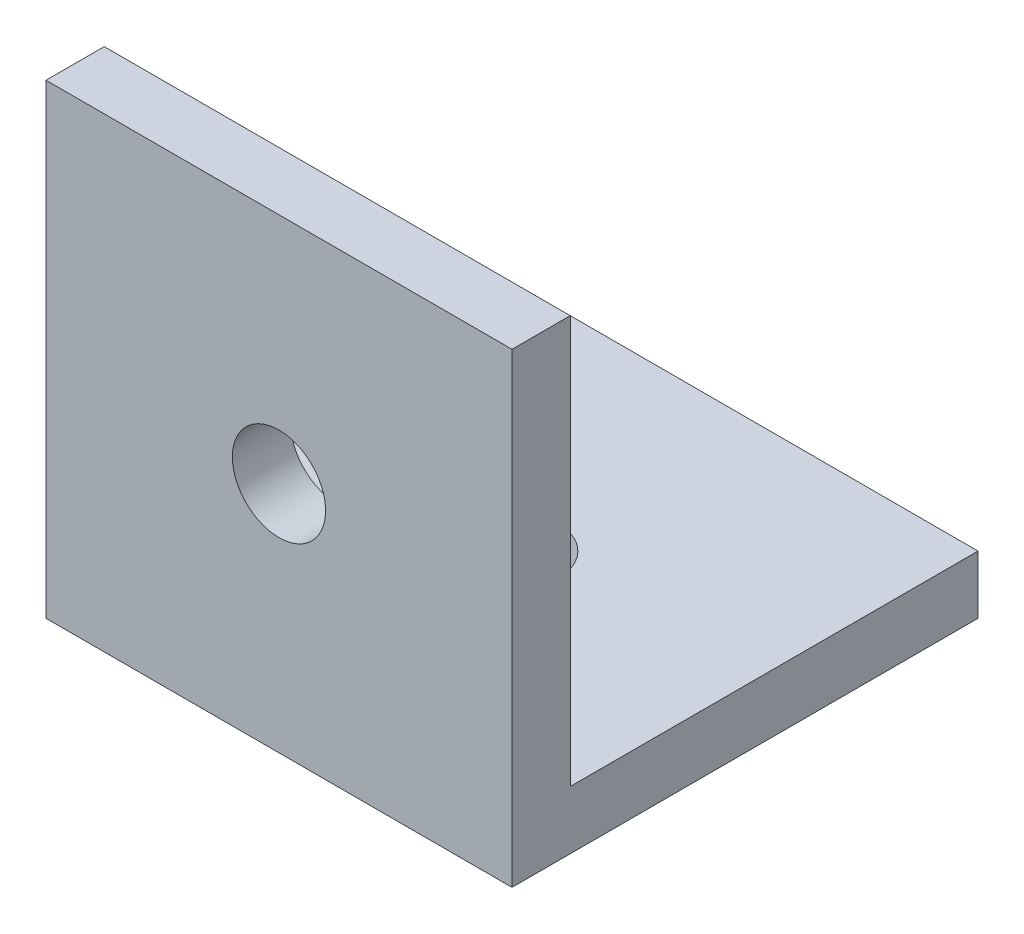
ISO-10303-21;
HEADER;
FILE_DESCRIPTION(('STEP AP214'),'2;1');
FILE_NAME('part.step','',(''),(''),'','','');
FILE_SCHEMA(('AUTOMOTIVE_DESIGN { 1 0 10303 214 1 1 1 1 }'));
ENDSEC;
DATA;
#1=APPLICATION_CONTEXT('core data for automotive mechanical design processes');
#2=APPLICATION_PROTOCOL_DEFINITION('international standard','automotive_design',2000,#1);
#3=PRODUCT_CONTEXT('',#1,'mechanical');
#4=PRODUCT('Part','Part','',(#3));
#5=PRODUCT_RELATED_PRODUCT_CATEGORY('part','',(#4));
#6=PRODUCT_DEFINITION_FORMATION('','',#4);
#7=PRODUCT_DEFINITION_CONTEXT('part definition',#1,'design');
#8=PRODUCT_DEFINITION('design','',#6,#7);
#9=PRODUCT_DEFINITION_SHAPE('','',#8);
#10=(LENGTH_UNIT() NAMED_UNIT(*) SI_UNIT(.MILLI.,.METRE.));
#11=(NAMED_UNIT(*) PLANE_ANGLE_UNIT() SI_UNIT($,.RADIAN.));
#12=(NAMED_UNIT(*) SI_UNIT($,.STERADIAN.) SOLID_ANGLE_UNIT());
#13=UNCERTAINTY_MEASURE_WITH_UNIT(LENGTH_MEASURE(1.E-05),#10,'distance_accuracy_value','');
#14=(GEOMETRIC_REPRESENTATION_CONTEXT(3) GLOBAL_UNCERTAINTY_ASSIGNED_CONTEXT((#13)) GLOBAL_UNIT_ASSIGNED_CONTEXT((#10,
#11,#12)) REPRESENTATION_CONTEXT('',''));
#15=CARTESIAN_POINT('',(0.,0.,0.));
#16=DIRECTION('',(0.,0.,1.));
#17=DIRECTION('',(1.,0.,0.));
#18=AXIS2_PLACEMENT_3D('',#15,#16,#17);
#19=CARTESIAN_POINT('',(0.,0.,0.));
#20=DIRECTION('',(0.,0.,1.));
#21=DIRECTION('',(1.,0.,0.));
#22=AXIS2_PLACEMENT_3D('',#19,#20,#21);
#23=PLANE('',#22);
#24=CARTESIAN_POINT('',(0.,0.,0.));
#25=DIRECTION('',(0.,0.,-1.));
#26=DIRECTION('',(-1.,0.,0.));
#27=AXIS2_PLACEMENT_3D('',#24,#25,#26);
#28=CIRCLE('',#27,2.54);
#29=CARTESIAN_POINT('',(-2.54,0.,0.));
#30=VERTEX_POINT('',#29);
#31=EDGE_CURVE('E152',#30,#30,#28,.T.);
#32=ORIENTED_EDGE('',*,*,#31,.F.);
#33=EDGE_LOOP('',(#32));
#34=FACE_BOUND('',#33,.T.);
#35=DIRECTION('',(1.,0.,0.));
#36=VECTOR('',#35,1.);
#37=CARTESIAN_POINT('',(-12.7,-9.525,0.));
#38=LINE('',#37,#36);
#39=CARTESIAN_POINT('',(-12.7,-9.525,0.));
#40=VERTEX_POINT('',#39);
#41=CARTESIAN_POINT('',(12.7,-9.525,0.));
#42=VERTEX_POINT('',#41);
#43=EDGE_CURVE('E49',#40,#42,#38,.T.);
#44=ORIENTED_EDGE('',*,*,#43,.F.);
#45=DIRECTION('',(0.,-1.,0.));
#46=VECTOR('',#45,1.);
#47=CARTESIAN_POINT('',(-12.7,-12.7,0.));
#48=LINE('',#47,#46);
#49=CARTESIAN_POINT('',(-12.7,12.7,0.));
#50=VERTEX_POINT('',#49);
#51=EDGE_CURVE('E117',#50,#40,#48,.T.);
#52=ORIENTED_EDGE('',*,*,#51,.F.);
#53=DIRECTION('',(-1.,0.,0.));
#54=VECTOR('',#53,1.);
#55=CARTESIAN_POINT('',(12.7,12.7,0.));
#56=LINE('',#55,#54);
#57=CARTESIAN_POINT('',(12.7,12.7,0.));
#58=VERTEX_POINT('',#57);
#59=EDGE_CURVE('E73',#58,#50,#56,.T.);
#60=ORIENTED_EDGE('',*,*,#59,.F.);
#61=DIRECTION('',(0.,1.,0.));
#62=VECTOR('',#61,1.);
#63=CARTESIAN_POINT('',(12.7,-12.7,0.));
#64=LINE('',#63,#62);
#65=EDGE_CURVE('E119',#42,#58,#64,.T.);
#66=ORIENTED_EDGE('',*,*,#65,.F.);
#67=EDGE_LOOP('',(#44,#52,#60,#66));
#68=FACE_BOUND('',#67,.T.);
#69=ADVANCED_FACE('F34',(#34,#68),#23,.F.);
#70=CARTESIAN_POINT('',(-12.7,-12.7,3.175));
#71=DIRECTION('',(1.,0.,0.));
#72=DIRECTION('',(0.,0.,-1.));
#73=AXIS2_PLACEMENT_3D('',#70,#71,#72);
#74=PLANE('',#73);
#75=ORIENTED_EDGE('',*,*,#51,.T.);
#76=DIRECTION('',(0.,0.,1.));
#77=VECTOR('',#76,1.);
#78=CARTESIAN_POINT('',(-12.7,-9.525,-22.225));
#79=LINE('',#78,#77);
#80=CARTESIAN_POINT('',(-12.7,-9.525,-22.225));
#81=VERTEX_POINT('',#80);
#82=EDGE_CURVE('E100',#81,#40,#79,.T.);
#83=ORIENTED_EDGE('',*,*,#82,.F.);
#84=DIRECTION('',(0.,1.,0.));
#85=VECTOR('',#84,1.);
#86=CARTESIAN_POINT('',(-12.7,-9.525,-22.225));
#87=LINE('',#86,#85);
#88=CARTESIAN_POINT('',(-12.7,-12.7,-22.225));
#89=VERTEX_POINT('',#88);
#90=EDGE_CURVE('E107',#89,#81,#87,.T.);
#91=ORIENTED_EDGE('',*,*,#90,.F.);
#92=DIRECTION('',(0.,0.,-1.));
#93=VECTOR('',#92,1.);
#94=CARTESIAN_POINT('',(-12.7,-12.7,3.175));
#95=LINE('',#94,#93);
#96=CARTESIAN_POINT('',(-12.7,-12.7,3.175));
#97=VERTEX_POINT('',#96);
#98=EDGE_CURVE('E11',#97,#89,#95,.T.);
#99=ORIENTED_EDGE('',*,*,#98,.F.);
#100=DIRECTION('',(0.,-1.,0.));
#101=VECTOR('',#100,1.);
#102=CARTESIAN_POINT('',(-12.7,-12.7,3.175));
#103=LINE('',#102,#101);
#104=CARTESIAN_POINT('',(-12.7,12.7,3.175));
#105=VERTEX_POINT('',#104);
#106=EDGE_CURVE('E124',#105,#97,#103,.T.);
#107=ORIENTED_EDGE('',*,*,#106,.F.);
#108=DIRECTION('',(0.,0.,-1.));
#109=VECTOR('',#108,1.);
#110=CARTESIAN_POINT('',(-12.7,12.7,3.175));
#111=LINE('',#110,#109);
#112=EDGE_CURVE('E129',#105,#50,#111,.T.);
#113=ORIENTED_EDGE('',*,*,#112,.T.);
#114=EDGE_LOOP('',(#75,#83,#91,#99,#107,#113));
#115=FACE_BOUND('',#114,.T.);
#116=ADVANCED_FACE('F36',(#115),#74,.F.);
#117=CARTESIAN_POINT('',(12.7,-12.7,3.175));
#118=DIRECTION('',(0.,1.,0.));
#119=DIRECTION('',(0.,0.,1.));
#120=AXIS2_PLACEMENT_3D('',#117,#118,#119);
#121=PLANE('',#120);
#122=CARTESIAN_POINT('',(0.,-12.7,-9.525));
#123=DIRECTION('',(0.,1.,0.));
#124=DIRECTION('',(0.,0.,1.));
#125=AXIS2_PLACEMENT_3D('',#122,#123,#124);
#126=CIRCLE('',#125,2.54);
#127=CARTESIAN_POINT('',(0.,-12.7,-6.985));
#128=VERTEX_POINT('',#127);
#129=EDGE_CURVE('E142',#128,#128,#126,.T.);
#130=ORIENTED_EDGE('',*,*,#129,.T.);
#131=EDGE_LOOP('',(#130));
#132=FACE_BOUND('',#131,.T.);
#133=ORIENTED_EDGE('',*,*,#98,.T.);
#134=DIRECTION('',(-1.,0.,0.));
#135=VECTOR('',#134,1.);
#136=CARTESIAN_POINT('',(-12.7,-12.7,-22.225));
#137=LINE('',#136,#135);
#138=CARTESIAN_POINT('',(12.7,-12.7,-22.225));
#139=VERTEX_POINT('',#138);
#140=EDGE_CURVE('E113',#139,#89,#137,.T.);
#141=ORIENTED_EDGE('',*,*,#140,.F.);
#142=DIRECTION('',(0.,0.,-1.));
#143=VECTOR('',#142,1.);
#144=CARTESIAN_POINT('',(12.7,-12.7,3.175));
#145=LINE('',#144,#143);
#146=CARTESIAN_POINT('',(12.7,-12.7,3.175));
#147=VERTEX_POINT('',#146);
#148=EDGE_CURVE('E42',#147,#139,#145,.T.);
#149=ORIENTED_EDGE('',*,*,#148,.F.);
#150=DIRECTION('',(1.,0.,0.));
#151=VECTOR('',#150,1.);
#152=CARTESIAN_POINT('',(12.7,-12.7,3.175));
#153=LINE('',#152,#151);
#154=EDGE_CURVE('E80',#97,#147,#153,.T.);
#155=ORIENTED_EDGE('',*,*,#154,.F.);
#156=EDGE_LOOP('',(#133,#141,#149,#155));
#157=FACE_BOUND('',#156,.T.);
#158=ADVANCED_FACE('F140',(#132,#157),#121,.F.);
#159=CARTESIAN_POINT('',(12.7,-12.7,3.175));
#160=DIRECTION('',(-1.,0.,0.));
#161=DIRECTION('',(0.,0.,1.));
#162=AXIS2_PLACEMENT_3D('',#159,#160,#161);
#163=PLANE('',#162);
#164=ORIENTED_EDGE('',*,*,#148,.T.);
#165=DIRECTION('',(0.,-1.,0.));
#166=VECTOR('',#165,1.);
#167=CARTESIAN_POINT('',(12.7,-9.525,-22.225));
#168=LINE('',#167,#166);
#169=CARTESIAN_POINT('',(12.7,-9.525,-22.225));
#170=VERTEX_POINT('',#169);
#171=EDGE_CURVE('E106',#170,#139,#168,.T.);
#172=ORIENTED_EDGE('',*,*,#171,.F.);
#173=DIRECTION('',(0.,0.,1.));
#174=VECTOR('',#173,1.);
#175=CARTESIAN_POINT('',(12.7,-9.525,-22.225));
#176=LINE('',#175,#174);
#177=EDGE_CURVE('E102',#170,#42,#176,.T.);
#178=ORIENTED_EDGE('',*,*,#177,.T.);
#179=ORIENTED_EDGE('',*,*,#65,.T.);
#180=DIRECTION('',(0.,0.,-1.));
#181=VECTOR('',#180,1.);
#182=CARTESIAN_POINT('',(12.7,12.7,3.175));
#183=LINE('',#182,#181);
#184=CARTESIAN_POINT('',(12.7,12.7,3.175));
#185=VERTEX_POINT('',#184);
#186=EDGE_CURVE('E134',#185,#58,#183,.T.);
#187=ORIENTED_EDGE('',*,*,#186,.F.);
#188=DIRECTION('',(0.,1.,0.));
#189=VECTOR('',#188,1.);
#190=CARTESIAN_POINT('',(12.7,-12.7,3.175));
#191=LINE('',#190,#189);
#192=EDGE_CURVE('E127',#147,#185,#191,.T.);
#193=ORIENTED_EDGE('',*,*,#192,.F.);
#194=EDGE_LOOP('',(#164,#172,#178,#179,#187,#193));
#195=FACE_BOUND('',#194,.T.);
#196=ADVANCED_FACE('F137',(#195),#163,.F.);
#197=CARTESIAN_POINT('',(12.7,12.7,3.175));
#198=DIRECTION('',(0.,-1.,0.));
#199=DIRECTION('',(1.,0.,0.));
#200=AXIS2_PLACEMENT_3D('',#197,#198,#199);
#201=PLANE('',#200);
#202=ORIENTED_EDGE('',*,*,#59,.T.);
#203=ORIENTED_EDGE('',*,*,#112,.F.);
#204=DIRECTION('',(-1.,0.,0.));
#205=VECTOR('',#204,1.);
#206=CARTESIAN_POINT('',(12.7,12.7,3.175));
#207=LINE('',#206,#205);
#208=EDGE_CURVE('E58',#185,#105,#207,.T.);
#209=ORIENTED_EDGE('',*,*,#208,.F.);
#210=ORIENTED_EDGE('',*,*,#186,.T.);
#211=EDGE_LOOP('',(#202,#203,#209,#210));
#212=FACE_BOUND('',#211,.T.);
#213=ADVANCED_FACE('F175',(#212),#201,.F.);
#214=CARTESIAN_POINT('',(0.,0.,3.175));
#215=DIRECTION('',(0.,0.,1.));
#216=DIRECTION('',(1.,0.,0.));
#217=AXIS2_PLACEMENT_3D('',#214,#215,#216);
#218=PLANE('',#217);
#219=CARTESIAN_POINT('',(0.,0.,3.175));
#220=DIRECTION('',(0.,0.,-1.));
#221=DIRECTION('',(-1.,0.,0.));
#222=AXIS2_PLACEMENT_3D('',#219,#220,#221);
#223=CIRCLE('',#222,2.54);
#224=CARTESIAN_POINT('',(-2.54,0.,3.175));
#225=VERTEX_POINT('',#224);
#226=EDGE_CURVE('E149',#225,#225,#223,.T.);
#227=ORIENTED_EDGE('',*,*,#226,.T.);
#228=EDGE_LOOP('',(#227));
#229=FACE_BOUND('',#228,.T.);
#230=ORIENTED_EDGE('',*,*,#106,.T.);
#231=ORIENTED_EDGE('',*,*,#154,.T.);
#232=ORIENTED_EDGE('',*,*,#192,.T.);
#233=ORIENTED_EDGE('',*,*,#208,.T.);
#234=EDGE_LOOP('',(#230,#231,#232,#233));
#235=FACE_BOUND('',#234,.T.);
#236=ADVANCED_FACE('F158',(#229,#235),#218,.T.);
#237=CARTESIAN_POINT('',(-12.7,-9.525,-22.225));
#238=DIRECTION('',(0.,-1.,0.));
#239=DIRECTION('',(0.,0.,-1.));
#240=AXIS2_PLACEMENT_3D('',#237,#238,#239);
#241=PLANE('',#240);
#242=CARTESIAN_POINT('',(0.,-9.525,-9.525));
#243=DIRECTION('',(0.,1.,0.));
#244=DIRECTION('',(0.,0.,1.));
#245=AXIS2_PLACEMENT_3D('',#242,#243,#244);
#246=CIRCLE('',#245,2.54);
#247=CARTESIAN_POINT('',(0.,-9.525,-6.985));
#248=VERTEX_POINT('',#247);
#249=EDGE_CURVE('E144',#248,#248,#246,.T.);
#250=ORIENTED_EDGE('',*,*,#249,.F.);
#251=EDGE_LOOP('',(#250));
#252=FACE_BOUND('',#251,.T.);
#253=ORIENTED_EDGE('',*,*,#43,.T.);
#254=ORIENTED_EDGE('',*,*,#177,.F.);
#255=DIRECTION('',(1.,0.,0.));
#256=VECTOR('',#255,1.);
#257=CARTESIAN_POINT('',(-12.7,-9.525,-22.225));
#258=LINE('',#257,#256);
#259=EDGE_CURVE('E96',#81,#170,#258,.T.);
#260=ORIENTED_EDGE('',*,*,#259,.F.);
#261=ORIENTED_EDGE('',*,*,#82,.T.);
#262=EDGE_LOOP('',(#253,#254,#260,#261));
#263=FACE_BOUND('',#262,.T.);
#264=ADVANCED_FACE('F98',(#252,#263),#241,.F.);
#265=CARTESIAN_POINT('',(0.,0.,-22.225));
#266=DIRECTION('',(0.,0.,1.));
#267=DIRECTION('',(1.,0.,0.));
#268=AXIS2_PLACEMENT_3D('',#265,#266,#267);
#269=PLANE('',#268);
#270=ORIENTED_EDGE('',*,*,#90,.T.);
#271=ORIENTED_EDGE('',*,*,#259,.T.);
#272=ORIENTED_EDGE('',*,*,#171,.T.);
#273=ORIENTED_EDGE('',*,*,#140,.T.);
#274=EDGE_LOOP('',(#270,#271,#272,#273));
#275=FACE_BOUND('',#274,.T.);
#276=ADVANCED_FACE('F111',(#275),#269,.F.);
#277=CARTESIAN_POINT('',(0.,-12.7,-9.525));
#278=DIRECTION('',(0.,1.,0.));
#279=DIRECTION('',(0.,0.,1.));
#280=AXIS2_PLACEMENT_3D('',#277,#278,#279);
#281=CYLINDRICAL_SURFACE('',#280,2.54);
#282=ORIENTED_EDGE('',*,*,#129,.F.);
#283=EDGE_LOOP('',(#282));
#284=FACE_BOUND('',#283,.T.);
#285=ORIENTED_EDGE('',*,*,#249,.T.);
#286=EDGE_LOOP('',(#285));
#287=FACE_BOUND('',#286,.T.);
#288=ADVANCED_FACE('F163',(#284,#287),#281,.F.);
#289=CARTESIAN_POINT('',(0.,0.,3.175));
#290=DIRECTION('',(0.,0.,-1.));
#291=DIRECTION('',(-1.,0.,0.));
#292=AXIS2_PLACEMENT_3D('',#289,#290,#291);
#293=CYLINDRICAL_SURFACE('',#292,2.54);
#294=ORIENTED_EDGE('',*,*,#226,.F.);
#295=EDGE_LOOP('',(#294));
#296=FACE_BOUND('',#295,.T.);
#297=ORIENTED_EDGE('',*,*,#31,.T.);
#298=EDGE_LOOP('',(#297));
#299=FACE_BOUND('',#298,.T.);
#300=ADVANCED_FACE('F160',(#296,#299),#293,.F.);
#301=CLOSED_SHELL('',(#69,#116,#158,#196,#213,#236,#264,#276,#288,#300));
#302=MANIFOLD_SOLID_BREP('B2',#301);
#303=ADVANCED_BREP_SHAPE_REPRESENTATION('',(#18,#302),#14);
#304=SHAPE_DEFINITION_REPRESENTATION(#9,#303);
ENDSEC;
END-ISO-10303-21;
